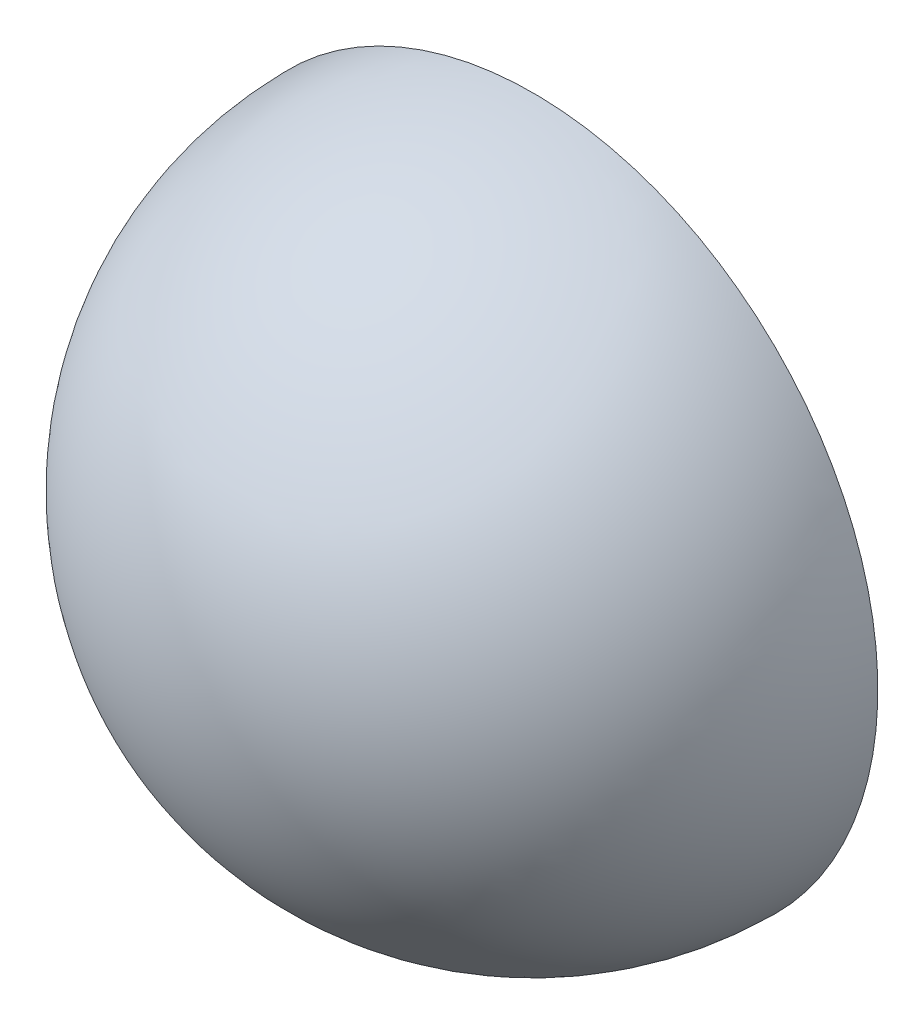
ISO-10303-21;
HEADER;
FILE_DESCRIPTION(('STEP AP214'),'2;1');
FILE_NAME('part.step','',(''),(''),'','','');
FILE_SCHEMA(('AUTOMOTIVE_DESIGN { 1 0 10303 214 1 1 1 1 }'));
ENDSEC;
DATA;
#1=APPLICATION_CONTEXT('core data for automotive mechanical design processes');
#2=APPLICATION_PROTOCOL_DEFINITION('international standard','automotive_design',2000,#1);
#3=PRODUCT_CONTEXT('',#1,'mechanical');
#4=PRODUCT('Part','Part','',(#3));
#5=PRODUCT_RELATED_PRODUCT_CATEGORY('part','',(#4));
#6=PRODUCT_DEFINITION_FORMATION('','',#4);
#7=PRODUCT_DEFINITION_CONTEXT('part definition',#1,'design');
#8=PRODUCT_DEFINITION('design','',#6,#7);
#9=PRODUCT_DEFINITION_SHAPE('','',#8);
#10=(LENGTH_UNIT() NAMED_UNIT(*) SI_UNIT(.MILLI.,.METRE.));
#11=(NAMED_UNIT(*) PLANE_ANGLE_UNIT() SI_UNIT($,.RADIAN.));
#12=(NAMED_UNIT(*) SI_UNIT($,.STERADIAN.) SOLID_ANGLE_UNIT());
#13=UNCERTAINTY_MEASURE_WITH_UNIT(LENGTH_MEASURE(1.E-05),#10,'distance_accuracy_value','');
#14=(GEOMETRIC_REPRESENTATION_CONTEXT(3) GLOBAL_UNCERTAINTY_ASSIGNED_CONTEXT((#13)) GLOBAL_UNIT_ASSIGNED_CONTEXT((#10,
#11,#12)) REPRESENTATION_CONTEXT('',''));
#15=CARTESIAN_POINT('',(0.,0.,0.));
#16=DIRECTION('',(0.,0.,1.));
#17=DIRECTION('',(1.,0.,0.));
#18=AXIS2_PLACEMENT_3D('',#15,#16,#17);
#19=CARTESIAN_POINT('',(0.,0.,0.));
#20=DIRECTION('',(0.,0.,-1.));
#21=DIRECTION('',(0.,-1.,0.));
#22=AXIS2_PLACEMENT_3D('',#19,#20,#21);
#23=PLANE('',#22);
#24=CARTESIAN_POINT('',(0.,0.,0.));
#25=DIRECTION('',(0.,0.,-1.));
#26=DIRECTION('',(1.,0.,0.));
#27=AXIS2_PLACEMENT_3D('',#24,#25,#26);
#28=CIRCLE('',#27,0.5);
#29=CARTESIAN_POINT('',(-0.5,0.,0.));
#30=VERTEX_POINT('',#29);
#31=EDGE_CURVE('E25',#30,#30,#28,.T.);
#32=ORIENTED_EDGE('',*,*,#31,.T.);
#33=EDGE_LOOP('',(#32));
#34=FACE_BOUND('',#33,.T.);
#35=ADVANCED_FACE('F17',(#34),#23,.T.);
#36=CARTESIAN_POINT('',(0.,0.,0.));
#37=DIRECTION('',(0.,0.,1.));
#38=DIRECTION('',(1.,0.,0.));
#39=AXIS2_PLACEMENT_3D('',#36,#37,#38);
#40=SPHERICAL_SURFACE('',#39,0.5);
#41=ORIENTED_EDGE('',*,*,#31,.F.);
#42=CARTESIAN_POINT('',(0.,0.,0.));
#43=DIRECTION('',(0.,-1.,0.));
#44=DIRECTION('',(-1.,0.,0.));
#45=AXIS2_PLACEMENT_3D('',#42,#43,#44);
#46=CIRCLE('',#45,0.5);
#47=CARTESIAN_POINT('',(0.,0.,0.5));
#48=VERTEX_POINT('',#47);
#49=EDGE_CURVE('E11',#48,#30,#46,.T.);
#50=ORIENTED_EDGE('',*,*,#49,.F.);
#51=ORIENTED_EDGE('',*,*,#49,.T.);
#52=EDGE_LOOP('',(#41,#50,#51));
#53=FACE_BOUND('',#52,.T.);
#54=ADVANCED_FACE('F38',(#53),#40,.T.);
#55=CLOSED_SHELL('',(#35,#54));
#56=MANIFOLD_SOLID_BREP('B1',#55);
#57=ADVANCED_BREP_SHAPE_REPRESENTATION('',(#18,#56),#14);
#58=SHAPE_DEFINITION_REPRESENTATION(#9,#57);
ENDSEC;
END-ISO-10303-21;
